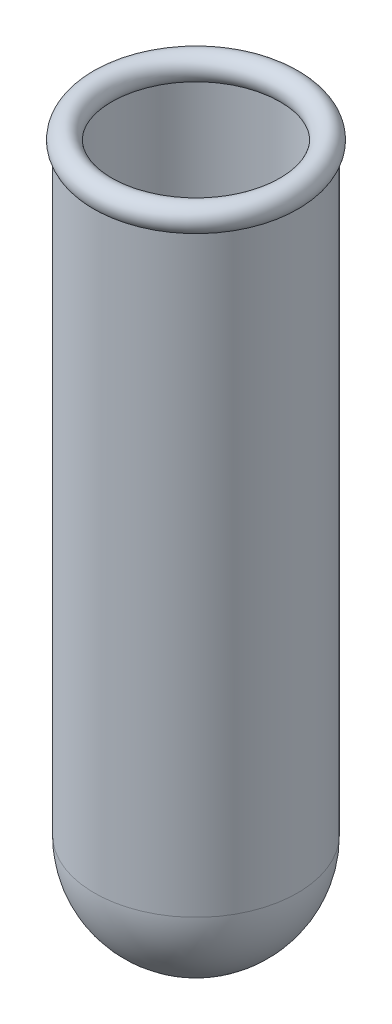
ISO-10303-21;
HEADER;
FILE_DESCRIPTION(('STEP AP214'),'2;1');
FILE_NAME('part.step','',(''),(''),'','','');
FILE_SCHEMA(('AUTOMOTIVE_DESIGN { 1 0 10303 214 1 1 1 1 }'));
ENDSEC;
DATA;
#1=APPLICATION_CONTEXT('core data for automotive mechanical design processes');
#2=APPLICATION_PROTOCOL_DEFINITION('international standard','automotive_design',2000,#1);
#3=PRODUCT_CONTEXT('',#1,'mechanical');
#4=PRODUCT('Part','Part','',(#3));
#5=PRODUCT_RELATED_PRODUCT_CATEGORY('part','',(#4));
#6=PRODUCT_DEFINITION_FORMATION('','',#4);
#7=PRODUCT_DEFINITION_CONTEXT('part definition',#1,'design');
#8=PRODUCT_DEFINITION('design','',#6,#7);
#9=PRODUCT_DEFINITION_SHAPE('','',#8);
#10=(LENGTH_UNIT() NAMED_UNIT(*) SI_UNIT(.MILLI.,.METRE.));
#11=(NAMED_UNIT(*) PLANE_ANGLE_UNIT() SI_UNIT($,.RADIAN.));
#12=(NAMED_UNIT(*) SI_UNIT($,.STERADIAN.) SOLID_ANGLE_UNIT());
#13=UNCERTAINTY_MEASURE_WITH_UNIT(LENGTH_MEASURE(1.E-05),#10,'distance_accuracy_value','');
#14=(GEOMETRIC_REPRESENTATION_CONTEXT(3) GLOBAL_UNCERTAINTY_ASSIGNED_CONTEXT((#13)) GLOBAL_UNIT_ASSIGNED_CONTEXT((#10,
#11,#12)) REPRESENTATION_CONTEXT('',''));
#15=CARTESIAN_POINT('',(0.,0.,0.));
#16=DIRECTION('',(0.,0.,1.));
#17=DIRECTION('',(1.,0.,0.));
#18=AXIS2_PLACEMENT_3D('',#15,#16,#17);
#19=CARTESIAN_POINT('',(0.,35.5590169943749,0.));
#20=DIRECTION('',(0.,-1.,0.));
#21=DIRECTION('',(0.,0.,-1.));
#22=AXIS2_PLACEMENT_3D('',#19,#20,#21);
#23=TOROIDAL_SURFACE('',#22,5.5,0.749999999999999);
#24=CARTESIAN_POINT('',(0.,35.,0.));
#25=DIRECTION('',(0.,-1.,0.));
#26=DIRECTION('',(0.,0.,-1.));
#27=AXIS2_PLACEMENT_3D('',#24,#25,#26);
#28=CIRCLE('',#27,5.);
#29=CARTESIAN_POINT('',(0.,35.,-5.));
#30=VERTEX_POINT('',#29);
#31=EDGE_CURVE('E10',#30,#30,#28,.T.);
#32=ORIENTED_EDGE('',*,*,#31,.T.);
#33=EDGE_LOOP('',(#32));
#34=FACE_BOUND('',#33,.T.);
#35=CARTESIAN_POINT('',(0.,35.,0.));
#36=DIRECTION('',(0.,-1.,0.));
#37=DIRECTION('',(0.,0.,-1.));
#38=AXIS2_PLACEMENT_3D('',#35,#36,#37);
#39=CIRCLE('',#38,6.);
#40=CARTESIAN_POINT('',(0.,35.,-6.));
#41=VERTEX_POINT('',#40);
#42=EDGE_CURVE('E47',#41,#41,#39,.T.);
#43=ORIENTED_EDGE('',*,*,#42,.F.);
#44=EDGE_LOOP('',(#43));
#45=FACE_BOUND('',#44,.T.);
#46=ADVANCED_FACE('F33',(#34,#45),#23,.T.);
#47=CARTESIAN_POINT('',(0.,0.,0.));
#48=DIRECTION('',(0.,-1.,0.));
#49=DIRECTION('',(0.,0.,-1.));
#50=AXIS2_PLACEMENT_3D('',#47,#48,#49);
#51=CYLINDRICAL_SURFACE('',#50,5.);
#52=ORIENTED_EDGE('',*,*,#31,.F.);
#53=EDGE_LOOP('',(#52));
#54=FACE_BOUND('',#53,.T.);
#55=CARTESIAN_POINT('',(0.,0.,0.));
#56=DIRECTION('',(0.,-1.,0.));
#57=DIRECTION('',(0.,0.,-1.));
#58=AXIS2_PLACEMENT_3D('',#55,#56,#57);
#59=CIRCLE('',#58,5.);
#60=CARTESIAN_POINT('',(0.,0.,-5.));
#61=VERTEX_POINT('',#60);
#62=EDGE_CURVE('E39',#61,#61,#59,.T.);
#63=ORIENTED_EDGE('',*,*,#62,.T.);
#64=EDGE_LOOP('',(#63));
#65=FACE_BOUND('',#64,.T.);
#66=ADVANCED_FACE('F57',(#54,#65),#51,.F.);
#67=CARTESIAN_POINT('',(0.,0.,0.));
#68=DIRECTION('',(0.,-1.,0.));
#69=DIRECTION('',(-1.,0.,0.));
#70=AXIS2_PLACEMENT_3D('',#67,#68,#69);
#71=SPHERICAL_SURFACE('',#70,5.);
#72=ORIENTED_EDGE('',*,*,#62,.F.);
#73=EDGE_LOOP('',(#72));
#74=FACE_BOUND('',#73,.T.);
#75=ADVANCED_FACE('F61',(#74),#71,.F.);
#76=CARTESIAN_POINT('',(0.,0.,0.));
#77=DIRECTION('',(0.,-1.,0.));
#78=DIRECTION('',(-1.,0.,0.));
#79=AXIS2_PLACEMENT_3D('',#76,#77,#78);
#80=SPHERICAL_SURFACE('',#79,6.);
#81=CARTESIAN_POINT('',(0.,0.,0.));
#82=DIRECTION('',(0.,-1.,0.));
#83=DIRECTION('',(0.,0.,-1.));
#84=AXIS2_PLACEMENT_3D('',#81,#82,#83);
#85=CIRCLE('',#84,6.);
#86=CARTESIAN_POINT('',(0.,0.,-6.));
#87=VERTEX_POINT('',#86);
#88=EDGE_CURVE('E43',#87,#87,#85,.T.);
#89=ORIENTED_EDGE('',*,*,#88,.T.);
#90=EDGE_LOOP('',(#89));
#91=FACE_BOUND('',#90,.T.);
#92=ADVANCED_FACE('F66',(#91),#80,.T.);
#93=CARTESIAN_POINT('',(0.,0.,0.));
#94=DIRECTION('',(0.,-1.,0.));
#95=DIRECTION('',(0.,0.,-1.));
#96=AXIS2_PLACEMENT_3D('',#93,#94,#95);
#97=CYLINDRICAL_SURFACE('',#96,6.);
#98=ORIENTED_EDGE('',*,*,#42,.T.);
#99=EDGE_LOOP('',(#98));
#100=FACE_BOUND('',#99,.T.);
#101=ORIENTED_EDGE('',*,*,#88,.F.);
#102=EDGE_LOOP('',(#101));
#103=FACE_BOUND('',#102,.T.);
#104=ADVANCED_FACE('F53',(#100,#103),#97,.T.);
#105=CLOSED_SHELL('',(#46,#66,#75,#92,#104));
#106=MANIFOLD_SOLID_BREP('B2',#105);
#107=ADVANCED_BREP_SHAPE_REPRESENTATION('',(#18,#106),#14);
#108=SHAPE_DEFINITION_REPRESENTATION(#9,#107);
ENDSEC;
END-ISO-10303-21;
